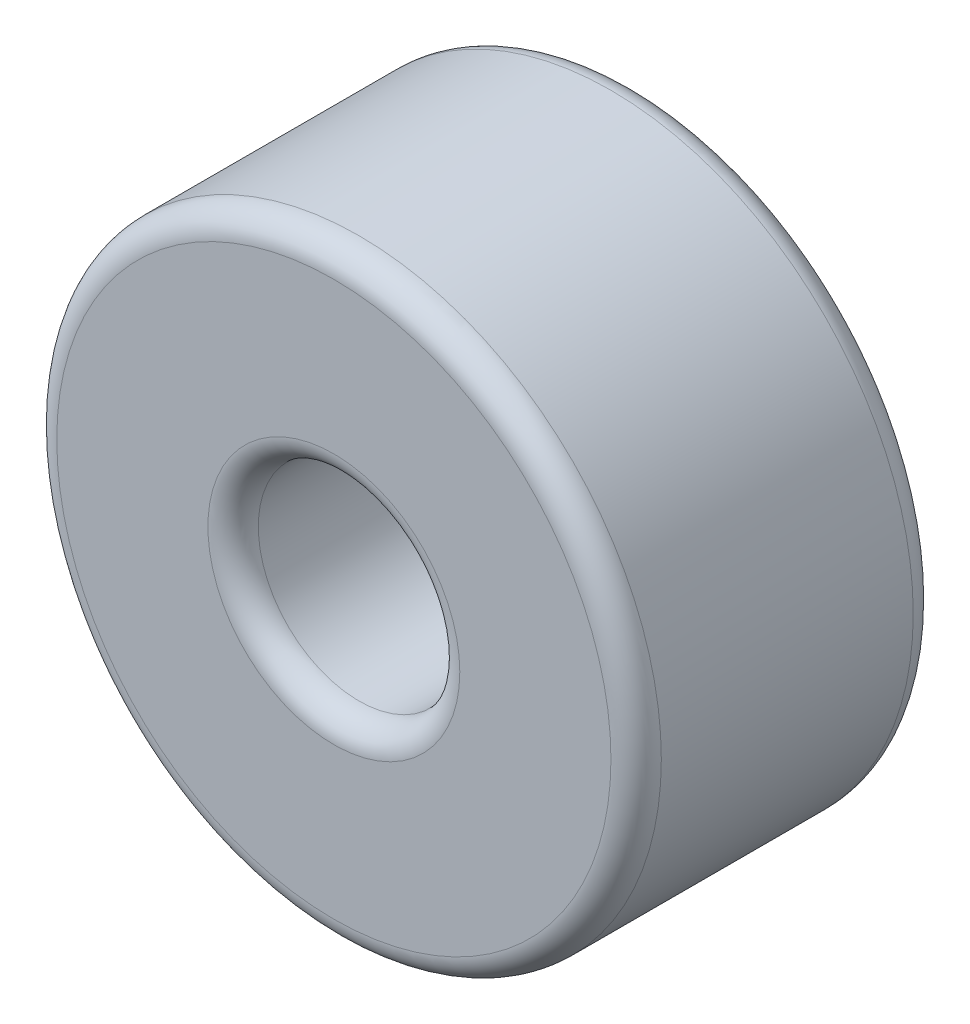
ISO-10303-21;
HEADER;
FILE_DESCRIPTION(('STEP AP214'),'2;1');
FILE_NAME('part.step','',(''),(''),'','','');
FILE_SCHEMA(('AUTOMOTIVE_DESIGN { 1 0 10303 214 1 1 1 1 }'));
ENDSEC;
DATA;
#1=APPLICATION_CONTEXT('core data for automotive mechanical design processes');
#2=APPLICATION_PROTOCOL_DEFINITION('international standard','automotive_design',2000,#1);
#3=PRODUCT_CONTEXT('',#1,'mechanical');
#4=PRODUCT('Part','Part','',(#3));
#5=PRODUCT_RELATED_PRODUCT_CATEGORY('part','',(#4));
#6=PRODUCT_DEFINITION_FORMATION('','',#4);
#7=PRODUCT_DEFINITION_CONTEXT('part definition',#1,'design');
#8=PRODUCT_DEFINITION('design','',#6,#7);
#9=PRODUCT_DEFINITION_SHAPE('','',#8);
#10=(LENGTH_UNIT() NAMED_UNIT(*) SI_UNIT(.MILLI.,.METRE.));
#11=(NAMED_UNIT(*) PLANE_ANGLE_UNIT() SI_UNIT($,.RADIAN.));
#12=(NAMED_UNIT(*) SI_UNIT($,.STERADIAN.) SOLID_ANGLE_UNIT());
#13=UNCERTAINTY_MEASURE_WITH_UNIT(LENGTH_MEASURE(1.E-05),#10,'distance_accuracy_value','');
#14=(GEOMETRIC_REPRESENTATION_CONTEXT(3) GLOBAL_UNCERTAINTY_ASSIGNED_CONTEXT((#13)) GLOBAL_UNIT_ASSIGNED_CONTEXT((#10,
#11,#12)) REPRESENTATION_CONTEXT('',''));
#15=CARTESIAN_POINT('',(0.,0.,0.));
#16=DIRECTION('',(0.,0.,1.));
#17=DIRECTION('',(1.,0.,0.));
#18=AXIS2_PLACEMENT_3D('',#15,#16,#17);
#19=CARTESIAN_POINT('',(0.,0.,3.));
#20=DIRECTION('',(0.,0.,1.));
#21=DIRECTION('',(1.,0.,0.));
#22=AXIS2_PLACEMENT_3D('',#19,#20,#21);
#23=PLANE('',#22);
#24=CARTESIAN_POINT('',(0.,0.,3.));
#25=DIRECTION('',(0.,0.,1.));
#26=DIRECTION('',(1.,0.,0.));
#27=AXIS2_PLACEMENT_3D('',#24,#25,#26);
#28=CIRCLE('',#27,1.25);
#29=CARTESIAN_POINT('',(1.25,0.,3.));
#30=VERTEX_POINT('',#29);
#31=EDGE_CURVE('E11',#30,#30,#28,.F.);
#32=ORIENTED_EDGE('',*,*,#31,.T.);
#33=EDGE_LOOP('',(#32));
#34=FACE_BOUND('',#33,.T.);
#35=CARTESIAN_POINT('',(0.,0.,3.));
#36=DIRECTION('',(0.,0.,1.));
#37=DIRECTION('',(1.,0.,0.));
#38=AXIS2_PLACEMENT_3D('',#35,#36,#37);
#39=CIRCLE('',#38,2.75);
#40=CARTESIAN_POINT('',(2.75,0.,3.));
#41=VERTEX_POINT('',#40);
#42=EDGE_CURVE('E54',#41,#41,#39,.T.);
#43=ORIENTED_EDGE('',*,*,#42,.T.);
#44=EDGE_LOOP('',(#43));
#45=FACE_BOUND('',#44,.T.);
#46=ADVANCED_FACE('F46',(#34,#45),#23,.T.);
#47=CARTESIAN_POINT('',(0.,0.,0.));
#48=DIRECTION('',(0.,0.,1.));
#49=DIRECTION('',(1.,0.,0.));
#50=AXIS2_PLACEMENT_3D('',#47,#48,#49);
#51=PLANE('',#50);
#52=CARTESIAN_POINT('',(0.,0.,0.));
#53=DIRECTION('',(0.,0.,1.));
#54=DIRECTION('',(1.,0.,0.));
#55=AXIS2_PLACEMENT_3D('',#52,#53,#54);
#56=CIRCLE('',#55,1.25);
#57=CARTESIAN_POINT('',(1.25,0.,0.));
#58=VERTEX_POINT('',#57);
#59=EDGE_CURVE('E78',#58,#58,#56,.T.);
#60=ORIENTED_EDGE('',*,*,#59,.T.);
#61=EDGE_LOOP('',(#60));
#62=FACE_BOUND('',#61,.T.);
#63=CARTESIAN_POINT('',(0.,0.,0.));
#64=DIRECTION('',(0.,0.,1.));
#65=DIRECTION('',(1.,0.,0.));
#66=AXIS2_PLACEMENT_3D('',#63,#64,#65);
#67=CIRCLE('',#66,2.75);
#68=CARTESIAN_POINT('',(2.75,0.,0.));
#69=VERTEX_POINT('',#68);
#70=EDGE_CURVE('E82',#69,#69,#67,.F.);
#71=ORIENTED_EDGE('',*,*,#70,.T.);
#72=EDGE_LOOP('',(#71));
#73=FACE_BOUND('',#72,.T.);
#74=ADVANCED_FACE('F87',(#62,#73),#51,.F.);
#75=CARTESIAN_POINT('',(0.,0.,3.));
#76=DIRECTION('',(0.,0.,-1.));
#77=DIRECTION('',(-1.,0.,0.));
#78=AXIS2_PLACEMENT_3D('',#75,#76,#77);
#79=CYLINDRICAL_SURFACE('',#78,3.);
#80=CARTESIAN_POINT('',(0.,0.,0.25));
#81=DIRECTION('',(0.,0.,1.));
#82=DIRECTION('',(1.,0.,0.));
#83=AXIS2_PLACEMENT_3D('',#80,#81,#82);
#84=CIRCLE('',#83,3.);
#85=CARTESIAN_POINT('',(3.,0.,0.25));
#86=VERTEX_POINT('',#85);
#87=EDGE_CURVE('E59',#86,#86,#84,.T.);
#88=ORIENTED_EDGE('',*,*,#87,.T.);
#89=EDGE_LOOP('',(#88));
#90=FACE_BOUND('',#89,.T.);
#91=CARTESIAN_POINT('',(0.,0.,2.75));
#92=DIRECTION('',(0.,0.,1.));
#93=DIRECTION('',(1.,0.,0.));
#94=AXIS2_PLACEMENT_3D('',#91,#92,#93);
#95=CIRCLE('',#94,3.);
#96=CARTESIAN_POINT('',(3.,0.,2.75));
#97=VERTEX_POINT('',#96);
#98=EDGE_CURVE('E64',#97,#97,#95,.F.);
#99=ORIENTED_EDGE('',*,*,#98,.T.);
#100=EDGE_LOOP('',(#99));
#101=FACE_BOUND('',#100,.T.);
#102=ADVANCED_FACE('F97',(#90,#101),#79,.T.);
#103=CARTESIAN_POINT('',(0.,0.,3.));
#104=DIRECTION('',(0.,0.,-1.));
#105=DIRECTION('',(-1.,0.,0.));
#106=AXIS2_PLACEMENT_3D('',#103,#104,#105);
#107=CYLINDRICAL_SURFACE('',#106,1.);
#108=CARTESIAN_POINT('',(0.,0.,0.25));
#109=DIRECTION('',(0.,0.,1.));
#110=DIRECTION('',(1.,0.,0.));
#111=AXIS2_PLACEMENT_3D('',#108,#109,#110);
#112=CIRCLE('',#111,1.);
#113=CARTESIAN_POINT('',(1.,0.,0.25));
#114=VERTEX_POINT('',#113);
#115=EDGE_CURVE('E70',#114,#114,#112,.F.);
#116=ORIENTED_EDGE('',*,*,#115,.T.);
#117=EDGE_LOOP('',(#116));
#118=FACE_BOUND('',#117,.T.);
#119=CARTESIAN_POINT('',(0.,0.,2.75));
#120=DIRECTION('',(0.,0.,1.));
#121=DIRECTION('',(1.,0.,0.));
#122=AXIS2_PLACEMENT_3D('',#119,#120,#121);
#123=CIRCLE('',#122,1.);
#124=CARTESIAN_POINT('',(1.,0.,2.75));
#125=VERTEX_POINT('',#124);
#126=EDGE_CURVE('E74',#125,#125,#123,.T.);
#127=ORIENTED_EDGE('',*,*,#126,.T.);
#128=EDGE_LOOP('',(#127));
#129=FACE_BOUND('',#128,.T.);
#130=ADVANCED_FACE('F100',(#118,#129),#107,.F.);
#131=CARTESIAN_POINT('',(0.,0.,0.25));
#132=DIRECTION('',(0.,0.,1.));
#133=DIRECTION('',(1.,0.,0.));
#134=AXIS2_PLACEMENT_3D('',#131,#132,#133);
#135=TOROIDAL_SURFACE('',#134,1.25,0.25);
#136=ORIENTED_EDGE('',*,*,#115,.F.);
#137=EDGE_LOOP('',(#136));
#138=FACE_BOUND('',#137,.T.);
#139=ORIENTED_EDGE('',*,*,#59,.F.);
#140=EDGE_LOOP('',(#139));
#141=FACE_BOUND('',#140,.T.);
#142=ADVANCED_FACE('F93',(#138,#141),#135,.T.);
#143=CARTESIAN_POINT('',(0.,0.,0.25));
#144=DIRECTION('',(0.,0.,1.));
#145=DIRECTION('',(1.,0.,0.));
#146=AXIS2_PLACEMENT_3D('',#143,#144,#145);
#147=TOROIDAL_SURFACE('',#146,2.75,0.25);
#148=ORIENTED_EDGE('',*,*,#70,.F.);
#149=EDGE_LOOP('',(#148));
#150=FACE_BOUND('',#149,.T.);
#151=ORIENTED_EDGE('',*,*,#87,.F.);
#152=EDGE_LOOP('',(#151));
#153=FACE_BOUND('',#152,.T.);
#154=ADVANCED_FACE('F89',(#150,#153),#147,.T.);
#155=CARTESIAN_POINT('',(0.,0.,2.75));
#156=DIRECTION('',(0.,0.,1.));
#157=DIRECTION('',(1.,0.,0.));
#158=AXIS2_PLACEMENT_3D('',#155,#156,#157);
#159=TOROIDAL_SURFACE('',#158,1.25,0.25);
#160=ORIENTED_EDGE('',*,*,#31,.F.);
#161=EDGE_LOOP('',(#160));
#162=FACE_BOUND('',#161,.T.);
#163=ORIENTED_EDGE('',*,*,#126,.F.);
#164=EDGE_LOOP('',(#163));
#165=FACE_BOUND('',#164,.T.);
#166=ADVANCED_FACE('F92',(#162,#165),#159,.T.);
#167=CARTESIAN_POINT('',(0.,0.,2.75));
#168=DIRECTION('',(0.,0.,1.));
#169=DIRECTION('',(1.,0.,0.));
#170=AXIS2_PLACEMENT_3D('',#167,#168,#169);
#171=TOROIDAL_SURFACE('',#170,2.75,0.25);
#172=ORIENTED_EDGE('',*,*,#98,.F.);
#173=EDGE_LOOP('',(#172));
#174=FACE_BOUND('',#173,.T.);
#175=ORIENTED_EDGE('',*,*,#42,.F.);
#176=EDGE_LOOP('',(#175));
#177=FACE_BOUND('',#176,.T.);
#178=ADVANCED_FACE('F48',(#174,#177),#171,.T.);
#179=CLOSED_SHELL('',(#46,#74,#102,#130,#142,#154,#166,#178));
#180=MANIFOLD_SOLID_BREP('B2',#179);
#181=ADVANCED_BREP_SHAPE_REPRESENTATION('',(#18,#180),#14);
#182=SHAPE_DEFINITION_REPRESENTATION(#9,#181);
ENDSEC;
END-ISO-10303-21;
